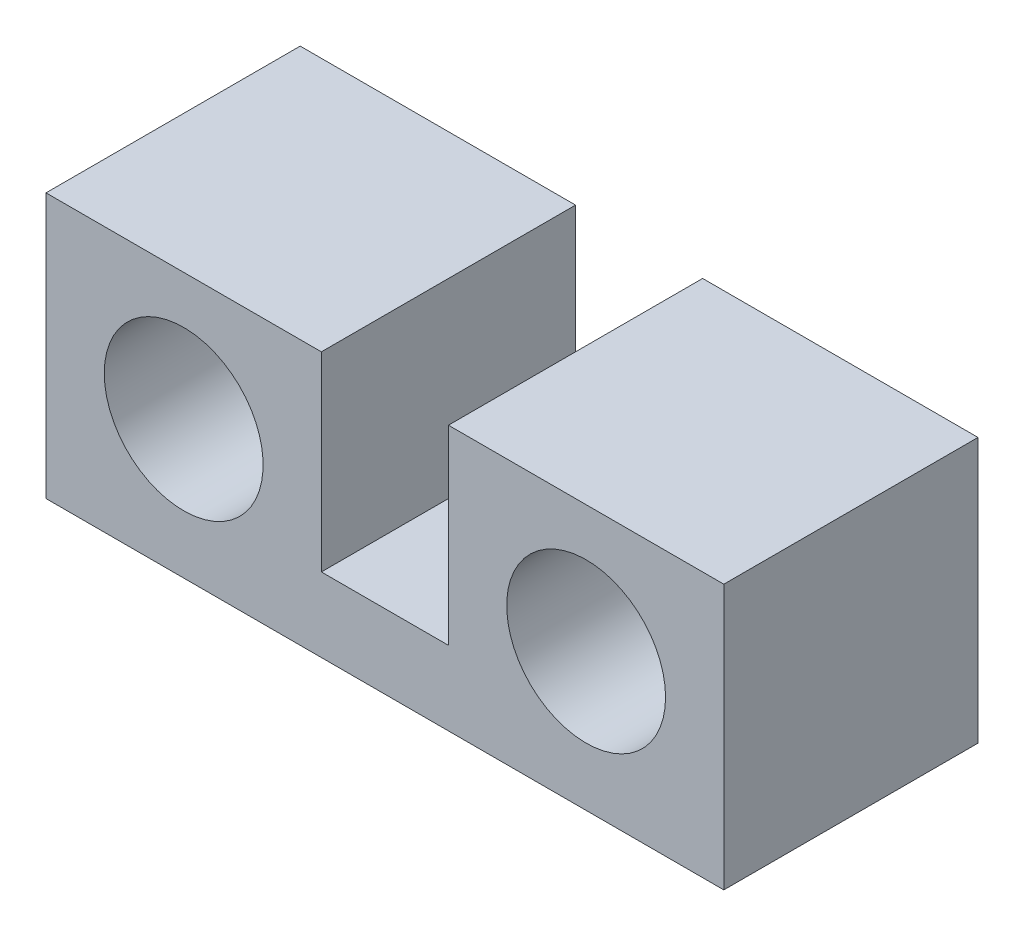
ISO-10303-21;
HEADER;
FILE_DESCRIPTION(('STEP AP214'),'2;1');
FILE_NAME('part.step','',(''),(''),'','','');
FILE_SCHEMA(('AUTOMOTIVE_DESIGN { 1 0 10303 214 1 1 1 1 }'));
ENDSEC;
DATA;
#1=APPLICATION_CONTEXT('core data for automotive mechanical design processes');
#2=APPLICATION_PROTOCOL_DEFINITION('international standard','automotive_design',2000,#1);
#3=PRODUCT_CONTEXT('',#1,'mechanical');
#4=PRODUCT('Part','Part','',(#3));
#5=PRODUCT_RELATED_PRODUCT_CATEGORY('part','',(#4));
#6=PRODUCT_DEFINITION_FORMATION('','',#4);
#7=PRODUCT_DEFINITION_CONTEXT('part definition',#1,'design');
#8=PRODUCT_DEFINITION('design','',#6,#7);
#9=PRODUCT_DEFINITION_SHAPE('','',#8);
#10=(LENGTH_UNIT() NAMED_UNIT(*) SI_UNIT(.MILLI.,.METRE.));
#11=(NAMED_UNIT(*) PLANE_ANGLE_UNIT() SI_UNIT($,.RADIAN.));
#12=(NAMED_UNIT(*) SI_UNIT($,.STERADIAN.) SOLID_ANGLE_UNIT());
#13=UNCERTAINTY_MEASURE_WITH_UNIT(LENGTH_MEASURE(1.E-05),#10,'distance_accuracy_value','');
#14=(GEOMETRIC_REPRESENTATION_CONTEXT(3) GLOBAL_UNCERTAINTY_ASSIGNED_CONTEXT((#13)) GLOBAL_UNIT_ASSIGNED_CONTEXT((#10,
#11,#12)) REPRESENTATION_CONTEXT('',''));
#15=CARTESIAN_POINT('',(0.,0.,0.));
#16=DIRECTION('',(0.,0.,1.));
#17=DIRECTION('',(1.,0.,0.));
#18=AXIS2_PLACEMENT_3D('',#15,#16,#17);
#19=CARTESIAN_POINT('',(6.,7.,-12.));
#20=DIRECTION('',(0.,1.,0.));
#21=DIRECTION('',(0.,0.,1.));
#22=AXIS2_PLACEMENT_3D('',#19,#20,#21);
#23=PLANE('',#22);
#24=DIRECTION('',(-1.,0.,0.));
#25=VECTOR('',#24,1.);
#26=CARTESIAN_POINT('',(6.,7.,-12.));
#27=LINE('',#26,#25);
#28=CARTESIAN_POINT('',(6.,7.,-12.));
#29=VERTEX_POINT('',#28);
#30=CARTESIAN_POINT('',(-6.,7.,-12.));
#31=VERTEX_POINT('',#30);
#32=EDGE_CURVE('E120',#29,#31,#27,.T.);
#33=ORIENTED_EDGE('',*,*,#32,.T.);
#34=DIRECTION('',(0.,0.,1.));
#35=VECTOR('',#34,1.);
#36=CARTESIAN_POINT('',(-6.,7.,-12.));
#37=LINE('',#36,#35);
#38=CARTESIAN_POINT('',(-6.,7.,12.));
#39=VERTEX_POINT('',#38);
#40=EDGE_CURVE('E118',#31,#39,#37,.T.);
#41=ORIENTED_EDGE('',*,*,#40,.T.);
#42=DIRECTION('',(-1.,0.,0.));
#43=VECTOR('',#42,1.);
#44=CARTESIAN_POINT('',(6.,7.,12.));
#45=LINE('',#44,#43);
#46=CARTESIAN_POINT('',(6.,7.,12.));
#47=VERTEX_POINT('',#46);
#48=EDGE_CURVE('E104',#47,#39,#45,.T.);
#49=ORIENTED_EDGE('',*,*,#48,.F.);
#50=DIRECTION('',(0.,0.,1.));
#51=VECTOR('',#50,1.);
#52=CARTESIAN_POINT('',(6.,7.,-12.));
#53=LINE('',#52,#51);
#54=EDGE_CURVE('E11',#29,#47,#53,.T.);
#55=ORIENTED_EDGE('',*,*,#54,.F.);
#56=EDGE_LOOP('',(#33,#41,#49,#55));
#57=FACE_BOUND('',#56,.T.);
#58=ADVANCED_FACE('F39',(#57),#23,.T.);
#59=CARTESIAN_POINT('',(5.99999999999999,25.,-12.));
#60=DIRECTION('',(-1.,0.,0.));
#61=DIRECTION('',(0.,-1.,0.));
#62=AXIS2_PLACEMENT_3D('',#59,#60,#61);
#63=PLANE('',#62);
#64=ORIENTED_EDGE('',*,*,#54,.T.);
#65=DIRECTION('',(0.,-1.,0.));
#66=VECTOR('',#65,1.);
#67=CARTESIAN_POINT('',(5.99999999999999,25.,12.));
#68=LINE('',#67,#66);
#69=CARTESIAN_POINT('',(5.99999999999999,25.,12.));
#70=VERTEX_POINT('',#69);
#71=EDGE_CURVE('E113',#70,#47,#68,.T.);
#72=ORIENTED_EDGE('',*,*,#71,.F.);
#73=DIRECTION('',(0.,0.,1.));
#74=VECTOR('',#73,1.);
#75=CARTESIAN_POINT('',(5.99999999999999,25.,-12.));
#76=LINE('',#75,#74);
#77=CARTESIAN_POINT('',(5.99999999999999,25.,-12.));
#78=VERTEX_POINT('',#77);
#79=EDGE_CURVE('E49',#78,#70,#76,.T.);
#80=ORIENTED_EDGE('',*,*,#79,.F.);
#81=DIRECTION('',(0.,-1.,0.));
#82=VECTOR('',#81,1.);
#83=CARTESIAN_POINT('',(5.99999999999999,25.,-12.));
#84=LINE('',#83,#82);
#85=EDGE_CURVE('E197',#78,#29,#84,.T.);
#86=ORIENTED_EDGE('',*,*,#85,.T.);
#87=EDGE_LOOP('',(#64,#72,#80,#86));
#88=FACE_BOUND('',#87,.T.);
#89=ADVANCED_FACE('F221',(#88),#63,.T.);
#90=CARTESIAN_POINT('',(32.,25.,-12.));
#91=DIRECTION('',(0.,1.,0.));
#92=DIRECTION('',(0.,0.,1.));
#93=AXIS2_PLACEMENT_3D('',#90,#91,#92);
#94=PLANE('',#93);
#95=ORIENTED_EDGE('',*,*,#79,.T.);
#96=DIRECTION('',(-1.,0.,0.));
#97=VECTOR('',#96,1.);
#98=CARTESIAN_POINT('',(32.,25.,12.));
#99=LINE('',#98,#97);
#100=CARTESIAN_POINT('',(32.,25.,12.));
#101=VERTEX_POINT('',#100);
#102=EDGE_CURVE('E177',#101,#70,#99,.T.);
#103=ORIENTED_EDGE('',*,*,#102,.F.);
#104=DIRECTION('',(0.,0.,1.));
#105=VECTOR('',#104,1.);
#106=CARTESIAN_POINT('',(32.,25.,-12.));
#107=LINE('',#106,#105);
#108=CARTESIAN_POINT('',(32.,25.,-12.));
#109=VERTEX_POINT('',#108);
#110=EDGE_CURVE('E203',#109,#101,#107,.T.);
#111=ORIENTED_EDGE('',*,*,#110,.F.);
#112=DIRECTION('',(-1.,0.,0.));
#113=VECTOR('',#112,1.);
#114=CARTESIAN_POINT('',(32.,25.,-12.));
#115=LINE('',#114,#113);
#116=EDGE_CURVE('E193',#109,#78,#115,.T.);
#117=ORIENTED_EDGE('',*,*,#116,.T.);
#118=EDGE_LOOP('',(#95,#103,#111,#117));
#119=FACE_BOUND('',#118,.T.);
#120=ADVANCED_FACE('F215',(#119),#94,.T.);
#121=CARTESIAN_POINT('',(32.,0.,-12.));
#122=DIRECTION('',(1.,0.,0.));
#123=DIRECTION('',(0.,0.,-1.));
#124=AXIS2_PLACEMENT_3D('',#121,#122,#123);
#125=PLANE('',#124);
#126=ORIENTED_EDGE('',*,*,#110,.T.);
#127=DIRECTION('',(0.,1.,0.));
#128=VECTOR('',#127,1.);
#129=CARTESIAN_POINT('',(32.,0.,12.));
#130=LINE('',#129,#128);
#131=CARTESIAN_POINT('',(32.,0.,12.));
#132=VERTEX_POINT('',#131);
#133=EDGE_CURVE('E173',#132,#101,#130,.T.);
#134=ORIENTED_EDGE('',*,*,#133,.F.);
#135=DIRECTION('',(0.,0.,1.));
#136=VECTOR('',#135,1.);
#137=CARTESIAN_POINT('',(32.,0.,-12.));
#138=LINE('',#137,#136);
#139=CARTESIAN_POINT('',(32.,0.,-12.));
#140=VERTEX_POINT('',#139);
#141=EDGE_CURVE('E43',#140,#132,#138,.T.);
#142=ORIENTED_EDGE('',*,*,#141,.F.);
#143=DIRECTION('',(0.,1.,0.));
#144=VECTOR('',#143,1.);
#145=CARTESIAN_POINT('',(32.,0.,-12.));
#146=LINE('',#145,#144);
#147=EDGE_CURVE('E189',#140,#109,#146,.T.);
#148=ORIENTED_EDGE('',*,*,#147,.T.);
#149=EDGE_LOOP('',(#126,#134,#142,#148));
#150=FACE_BOUND('',#149,.T.);
#151=ADVANCED_FACE('F213',(#150),#125,.T.);
#152=CARTESIAN_POINT('',(0.,0.,-12.));
#153=DIRECTION('',(0.,-1.,0.));
#154=DIRECTION('',(0.,0.,-1.));
#155=AXIS2_PLACEMENT_3D('',#152,#153,#154);
#156=PLANE('',#155);
#157=ORIENTED_EDGE('',*,*,#141,.T.);
#158=DIRECTION('',(1.,0.,0.));
#159=VECTOR('',#158,1.);
#160=CARTESIAN_POINT('',(0.,0.,12.));
#161=LINE('',#160,#159);
#162=CARTESIAN_POINT('',(-32.,0.,12.));
#163=VERTEX_POINT('',#162);
#164=EDGE_CURVE('E169',#163,#132,#161,.T.);
#165=ORIENTED_EDGE('',*,*,#164,.F.);
#166=DIRECTION('',(0.,0.,1.));
#167=VECTOR('',#166,1.);
#168=CARTESIAN_POINT('',(-32.,0.,-12.));
#169=LINE('',#168,#167);
#170=CARTESIAN_POINT('',(-32.,0.,-12.));
#171=VERTEX_POINT('',#170);
#172=EDGE_CURVE('E156',#171,#163,#169,.T.);
#173=ORIENTED_EDGE('',*,*,#172,.F.);
#174=DIRECTION('',(1.,0.,0.));
#175=VECTOR('',#174,1.);
#176=CARTESIAN_POINT('',(0.,0.,-12.));
#177=LINE('',#176,#175);
#178=EDGE_CURVE('E185',#171,#140,#177,.T.);
#179=ORIENTED_EDGE('',*,*,#178,.T.);
#180=EDGE_LOOP('',(#157,#165,#173,#179));
#181=FACE_BOUND('',#180,.T.);
#182=ADVANCED_FACE('F41',(#181),#156,.T.);
#183=CARTESIAN_POINT('',(0.,0.,-12.));
#184=DIRECTION('',(0.,0.,1.));
#185=DIRECTION('',(1.,0.,0.));
#186=AXIS2_PLACEMENT_3D('',#183,#184,#185);
#187=PLANE('',#186);
#188=CARTESIAN_POINT('',(19.,13.,-12.));
#189=DIRECTION('',(0.,0.,1.));
#190=DIRECTION('',(1.,0.,0.));
#191=AXIS2_PLACEMENT_3D('',#188,#189,#190);
#192=CIRCLE('',#191,7.5);
#193=CARTESIAN_POINT('',(26.5,13.,-12.));
#194=VERTEX_POINT('',#193);
#195=EDGE_CURVE('E115',#194,#194,#192,.T.);
#196=ORIENTED_EDGE('',*,*,#195,.T.);
#197=EDGE_LOOP('',(#196));
#198=FACE_BOUND('',#197,.T.);
#199=ORIENTED_EDGE('',*,*,#178,.F.);
#200=DIRECTION('',(0.,1.,0.));
#201=VECTOR('',#200,1.);
#202=CARTESIAN_POINT('',(-32.,0.,-12.));
#203=LINE('',#202,#201);
#204=CARTESIAN_POINT('',(-32.,25.,-12.));
#205=VERTEX_POINT('',#204);
#206=EDGE_CURVE('E126',#171,#205,#203,.T.);
#207=ORIENTED_EDGE('',*,*,#206,.T.);
#208=DIRECTION('',(1.,0.,0.));
#209=VECTOR('',#208,1.);
#210=CARTESIAN_POINT('',(-32.,25.,-12.));
#211=LINE('',#210,#209);
#212=CARTESIAN_POINT('',(-5.99999999999999,25.,-12.));
#213=VERTEX_POINT('',#212);
#214=EDGE_CURVE('E151',#205,#213,#211,.T.);
#215=ORIENTED_EDGE('',*,*,#214,.T.);
#216=DIRECTION('',(0.,-1.,0.));
#217=VECTOR('',#216,1.);
#218=CARTESIAN_POINT('',(-5.99999999999999,25.,-12.));
#219=LINE('',#218,#217);
#220=EDGE_CURVE('E148',#213,#31,#219,.T.);
#221=ORIENTED_EDGE('',*,*,#220,.T.);
#222=ORIENTED_EDGE('',*,*,#32,.F.);
#223=ORIENTED_EDGE('',*,*,#85,.F.);
#224=ORIENTED_EDGE('',*,*,#116,.F.);
#225=ORIENTED_EDGE('',*,*,#147,.F.);
#226=EDGE_LOOP('',(#199,#207,#215,#221,#222,#223,#224,#225));
#227=FACE_BOUND('',#226,.T.);
#228=CARTESIAN_POINT('',(-19.,13.,-12.));
#229=DIRECTION('',(0.,0.,-1.));
#230=DIRECTION('',(-1.,0.,0.));
#231=AXIS2_PLACEMENT_3D('',#228,#229,#230);
#232=CIRCLE('',#231,7.5);
#233=CARTESIAN_POINT('',(-26.5,13.,-12.));
#234=VERTEX_POINT('',#233);
#235=EDGE_CURVE('E144',#234,#234,#232,.T.);
#236=ORIENTED_EDGE('',*,*,#235,.F.);
#237=EDGE_LOOP('',(#236));
#238=FACE_BOUND('',#237,.T.);
#239=ADVANCED_FACE('F220',(#198,#227,#238),#187,.F.);
#240=CARTESIAN_POINT('',(19.,13.,-12.));
#241=DIRECTION('',(0.,0.,1.));
#242=DIRECTION('',(1.,0.,0.));
#243=AXIS2_PLACEMENT_3D('',#240,#241,#242);
#244=CYLINDRICAL_SURFACE('',#243,7.5);
#245=ORIENTED_EDGE('',*,*,#195,.F.);
#246=EDGE_LOOP('',(#245));
#247=FACE_BOUND('',#246,.T.);
#248=CARTESIAN_POINT('',(19.,13.,12.));
#249=DIRECTION('',(0.,0.,1.));
#250=DIRECTION('',(1.,0.,0.));
#251=AXIS2_PLACEMENT_3D('',#248,#249,#250);
#252=CIRCLE('',#251,7.5);
#253=CARTESIAN_POINT('',(26.5,13.,12.));
#254=VERTEX_POINT('',#253);
#255=EDGE_CURVE('E160',#254,#254,#252,.T.);
#256=ORIENTED_EDGE('',*,*,#255,.T.);
#257=EDGE_LOOP('',(#256));
#258=FACE_BOUND('',#257,.T.);
#259=ADVANCED_FACE('F233',(#247,#258),#244,.F.);
#260=CARTESIAN_POINT('',(0.,0.,12.));
#261=DIRECTION('',(0.,0.,1.));
#262=DIRECTION('',(1.,0.,0.));
#263=AXIS2_PLACEMENT_3D('',#260,#261,#262);
#264=PLANE('',#263);
#265=ORIENTED_EDGE('',*,*,#48,.T.);
#266=DIRECTION('',(0.,-1.,0.));
#267=VECTOR('',#266,1.);
#268=CARTESIAN_POINT('',(-5.99999999999999,25.,12.));
#269=LINE('',#268,#267);
#270=CARTESIAN_POINT('',(-5.99999999999999,25.,12.));
#271=VERTEX_POINT('',#270);
#272=EDGE_CURVE('E110',#271,#39,#269,.T.);
#273=ORIENTED_EDGE('',*,*,#272,.F.);
#274=DIRECTION('',(1.,0.,0.));
#275=VECTOR('',#274,1.);
#276=CARTESIAN_POINT('',(-32.,25.,12.));
#277=LINE('',#276,#275);
#278=CARTESIAN_POINT('',(-32.,25.,12.));
#279=VERTEX_POINT('',#278);
#280=EDGE_CURVE('E131',#279,#271,#277,.T.);
#281=ORIENTED_EDGE('',*,*,#280,.F.);
#282=DIRECTION('',(0.,1.,0.));
#283=VECTOR('',#282,1.);
#284=CARTESIAN_POINT('',(-32.,0.,12.));
#285=LINE('',#284,#283);
#286=EDGE_CURVE('E136',#163,#279,#285,.T.);
#287=ORIENTED_EDGE('',*,*,#286,.F.);
#288=ORIENTED_EDGE('',*,*,#164,.T.);
#289=ORIENTED_EDGE('',*,*,#133,.T.);
#290=ORIENTED_EDGE('',*,*,#102,.T.);
#291=ORIENTED_EDGE('',*,*,#71,.T.);
#292=EDGE_LOOP('',(#265,#273,#281,#287,#288,#289,#290,#291));
#293=FACE_BOUND('',#292,.T.);
#294=ORIENTED_EDGE('',*,*,#255,.F.);
#295=EDGE_LOOP('',(#294));
#296=FACE_BOUND('',#295,.T.);
#297=CARTESIAN_POINT('',(-19.,13.,12.));
#298=DIRECTION('',(0.,0.,-1.));
#299=DIRECTION('',(-1.,0.,0.));
#300=AXIS2_PLACEMENT_3D('',#297,#298,#299);
#301=CIRCLE('',#300,7.5);
#302=CARTESIAN_POINT('',(-26.5,13.,12.));
#303=VERTEX_POINT('',#302);
#304=EDGE_CURVE('E132',#303,#303,#301,.T.);
#305=ORIENTED_EDGE('',*,*,#304,.T.);
#306=EDGE_LOOP('',(#305));
#307=FACE_BOUND('',#306,.T.);
#308=ADVANCED_FACE('F106',(#293,#296,#307),#264,.T.);
#309=CARTESIAN_POINT('',(-32.,0.,-12.));
#310=DIRECTION('',(1.,0.,0.));
#311=DIRECTION('',(0.,0.,-1.));
#312=AXIS2_PLACEMENT_3D('',#309,#310,#311);
#313=PLANE('',#312);
#314=ORIENTED_EDGE('',*,*,#172,.T.);
#315=ORIENTED_EDGE('',*,*,#286,.T.);
#316=DIRECTION('',(0.,0.,1.));
#317=VECTOR('',#316,1.);
#318=CARTESIAN_POINT('',(-32.,25.,-12.));
#319=LINE('',#318,#317);
#320=EDGE_CURVE('E161',#205,#279,#319,.T.);
#321=ORIENTED_EDGE('',*,*,#320,.F.);
#322=ORIENTED_EDGE('',*,*,#206,.F.);
#323=EDGE_LOOP('',(#314,#315,#321,#322));
#324=FACE_BOUND('',#323,.T.);
#325=ADVANCED_FACE('F240',(#324),#313,.F.);
#326=CARTESIAN_POINT('',(-32.,25.,-12.));
#327=DIRECTION('',(0.,-1.,0.));
#328=DIRECTION('',(0.,0.,-1.));
#329=AXIS2_PLACEMENT_3D('',#326,#327,#328);
#330=PLANE('',#329);
#331=ORIENTED_EDGE('',*,*,#320,.T.);
#332=ORIENTED_EDGE('',*,*,#280,.T.);
#333=DIRECTION('',(0.,0.,1.));
#334=VECTOR('',#333,1.);
#335=CARTESIAN_POINT('',(-5.99999999999999,25.,-12.));
#336=LINE('',#335,#334);
#337=EDGE_CURVE('E125',#213,#271,#336,.T.);
#338=ORIENTED_EDGE('',*,*,#337,.F.);
#339=ORIENTED_EDGE('',*,*,#214,.F.);
#340=EDGE_LOOP('',(#331,#332,#338,#339));
#341=FACE_BOUND('',#340,.T.);
#342=ADVANCED_FACE('F244',(#341),#330,.F.);
#343=CARTESIAN_POINT('',(-5.99999999999999,25.,-12.));
#344=DIRECTION('',(-1.,0.,0.));
#345=DIRECTION('',(0.,-1.,0.));
#346=AXIS2_PLACEMENT_3D('',#343,#344,#345);
#347=PLANE('',#346);
#348=ORIENTED_EDGE('',*,*,#337,.T.);
#349=ORIENTED_EDGE('',*,*,#272,.T.);
#350=ORIENTED_EDGE('',*,*,#40,.F.);
#351=ORIENTED_EDGE('',*,*,#220,.F.);
#352=EDGE_LOOP('',(#348,#349,#350,#351));
#353=FACE_BOUND('',#352,.T.);
#354=ADVANCED_FACE('F128',(#353),#347,.F.);
#355=CARTESIAN_POINT('',(-19.,13.,-12.));
#356=DIRECTION('',(0.,0.,1.));
#357=DIRECTION('',(1.,0.,0.));
#358=AXIS2_PLACEMENT_3D('',#355,#356,#357);
#359=CYLINDRICAL_SURFACE('',#358,7.5);
#360=ORIENTED_EDGE('',*,*,#235,.T.);
#361=EDGE_LOOP('',(#360));
#362=FACE_BOUND('',#361,.T.);
#363=ORIENTED_EDGE('',*,*,#304,.F.);
#364=EDGE_LOOP('',(#363));
#365=FACE_BOUND('',#364,.T.);
#366=ADVANCED_FACE('F243',(#362,#365),#359,.F.);
#367=CLOSED_SHELL('',(#58,#89,#120,#151,#182,#239,#259,#308,#325,#342,#354,#366));
#368=MANIFOLD_SOLID_BREP('B2',#367);
#369=ADVANCED_BREP_SHAPE_REPRESENTATION('',(#18,#368),#14);
#370=SHAPE_DEFINITION_REPRESENTATION(#9,#369);
ENDSEC;
END-ISO-10303-21;
